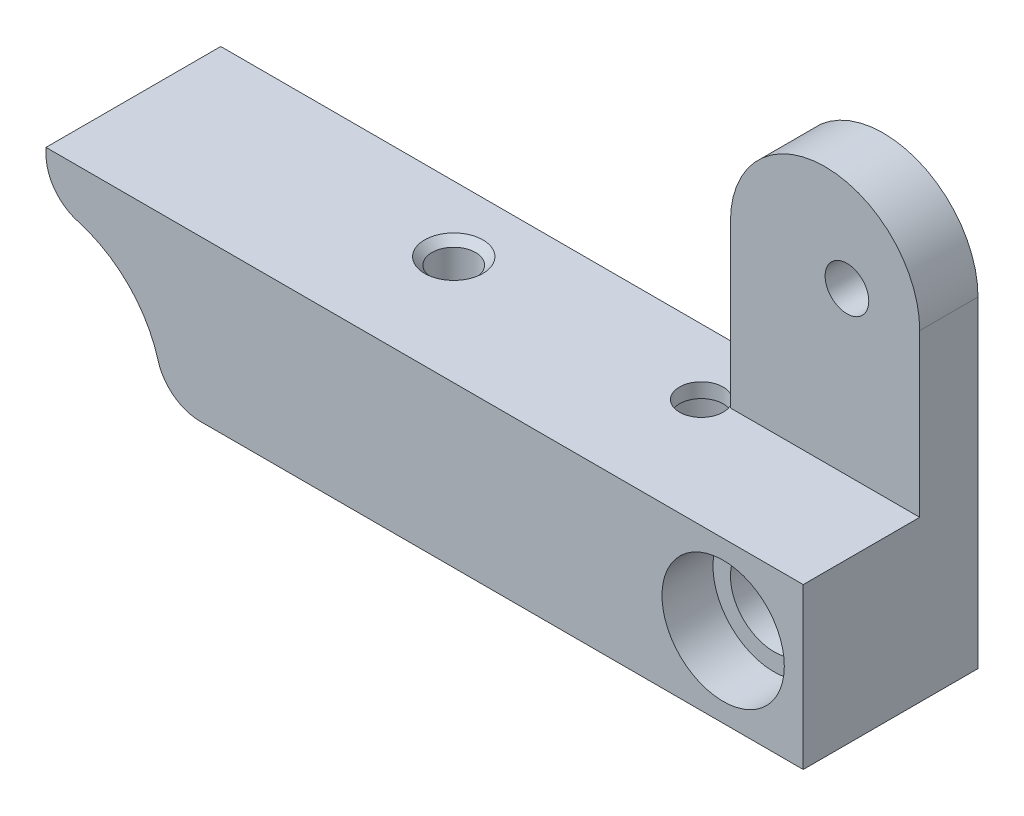
ISO-10303-21;
HEADER;
FILE_DESCRIPTION(('STEP AP214'),'2;1');
FILE_NAME('part.step','',(''),(''),'','','');
FILE_SCHEMA(('AUTOMOTIVE_DESIGN { 1 0 10303 214 1 1 1 1 }'));
ENDSEC;
DATA;
#1=APPLICATION_CONTEXT('core data for automotive mechanical design processes');
#2=APPLICATION_PROTOCOL_DEFINITION('international standard','automotive_design',2000,#1);
#3=PRODUCT_CONTEXT('',#1,'mechanical');
#4=PRODUCT('Part','Part','',(#3));
#5=PRODUCT_RELATED_PRODUCT_CATEGORY('part','',(#4));
#6=PRODUCT_DEFINITION_FORMATION('','',#4);
#7=PRODUCT_DEFINITION_CONTEXT('part definition',#1,'design');
#8=PRODUCT_DEFINITION('design','',#6,#7);
#9=PRODUCT_DEFINITION_SHAPE('','',#8);
#10=(LENGTH_UNIT() NAMED_UNIT(*) SI_UNIT(.MILLI.,.METRE.));
#11=(NAMED_UNIT(*) PLANE_ANGLE_UNIT() SI_UNIT($,.RADIAN.));
#12=(NAMED_UNIT(*) SI_UNIT($,.STERADIAN.) SOLID_ANGLE_UNIT());
#13=UNCERTAINTY_MEASURE_WITH_UNIT(LENGTH_MEASURE(1.E-05),#10,'distance_accuracy_value','');
#14=(GEOMETRIC_REPRESENTATION_CONTEXT(3) GLOBAL_UNCERTAINTY_ASSIGNED_CONTEXT((#13)) GLOBAL_UNIT_ASSIGNED_CONTEXT((#10,
#11,#12)) REPRESENTATION_CONTEXT('',''));
#15=CARTESIAN_POINT('',(0.,0.,0.));
#16=DIRECTION('',(0.,0.,1.));
#17=DIRECTION('',(1.,0.,0.));
#18=AXIS2_PLACEMENT_3D('',#15,#16,#17);
#19=CARTESIAN_POINT('',(10.5830052442584,3.,0.));
#20=DIRECTION('',(0.,0.,1.));
#21=DIRECTION('',(0.,-1.,0.));
#22=AXIS2_PLACEMENT_3D('',#19,#20,#21);
#23=CYLINDRICAL_SURFACE('',#22,3.);
#24=DIRECTION('',(0.,0.,1.));
#25=VECTOR('',#24,1.);
#26=CARTESIAN_POINT('',(10.5830052442584,0.,12.));
#27=LINE('',#26,#25);
#28=CARTESIAN_POINT('',(10.5830052442584,0.,12.));
#29=VERTEX_POINT('',#28);
#30=CARTESIAN_POINT('',(10.5830052442584,0.,0.));
#31=VERTEX_POINT('',#30);
#32=EDGE_CURVE('E250',#29,#31,#27,.F.);
#33=ORIENTED_EDGE('',*,*,#32,.F.);
#34=CARTESIAN_POINT('',(10.5830052442584,3.,12.));
#35=DIRECTION('',(0.,0.,1.));
#36=DIRECTION('',(1.,0.,0.));
#37=AXIS2_PLACEMENT_3D('',#34,#35,#36);
#38=CIRCLE('',#37,3.);
#39=CARTESIAN_POINT('',(7.69673108673336,2.18181818181818,12.));
#40=VERTEX_POINT('',#39);
#41=EDGE_CURVE('E71',#40,#29,#38,.T.);
#42=ORIENTED_EDGE('',*,*,#41,.F.);
#43=DIRECTION('',(0.,0.,1.));
#44=VECTOR('',#43,1.);
#45=CARTESIAN_POINT('',(7.69673108673335,2.18181818181818,0.));
#46=LINE('',#45,#44);
#47=CARTESIAN_POINT('',(7.69673108673335,2.18181818181818,0.));
#48=VERTEX_POINT('',#47);
#49=EDGE_CURVE('E254',#48,#40,#46,.T.);
#50=ORIENTED_EDGE('',*,*,#49,.F.);
#51=CARTESIAN_POINT('',(10.5830052442584,3.,0.));
#52=DIRECTION('',(0.,0.,1.));
#53=DIRECTION('',(1.,0.,0.));
#54=AXIS2_PLACEMENT_3D('',#51,#52,#53);
#55=CIRCLE('',#54,3.);
#56=EDGE_CURVE('E12',#31,#48,#55,.F.);
#57=ORIENTED_EDGE('',*,*,#56,.F.);
#58=EDGE_LOOP('',(#33,#42,#50,#57));
#59=FACE_BOUND('',#58,.T.);
#60=ADVANCED_FACE('F63',(#59),#23,.T.);
#61=CARTESIAN_POINT('',(3.,10.5830052442584,0.));
#62=DIRECTION('',(0.,0.,1.));
#63=DIRECTION('',(0.,-1.,0.));
#64=AXIS2_PLACEMENT_3D('',#61,#62,#63);
#65=CYLINDRICAL_SURFACE('',#64,3.);
#66=DIRECTION('',(0.,0.,1.));
#67=VECTOR('',#66,1.);
#68=CARTESIAN_POINT('',(0.,10.5830052442584,12.));
#69=LINE('',#68,#67);
#70=CARTESIAN_POINT('',(0.,10.5830052442583,0.));
#71=VERTEX_POINT('',#70);
#72=CARTESIAN_POINT('',(0.,10.5830052442583,12.));
#73=VERTEX_POINT('',#72);
#74=EDGE_CURVE('E235',#71,#73,#69,.T.);
#75=ORIENTED_EDGE('',*,*,#74,.F.);
#76=CARTESIAN_POINT('',(3.,10.5830052442584,0.));
#77=DIRECTION('',(0.,0.,1.));
#78=DIRECTION('',(1.,0.,0.));
#79=AXIS2_PLACEMENT_3D('',#76,#77,#78);
#80=CIRCLE('',#79,3.);
#81=CARTESIAN_POINT('',(2.18181818181818,7.69673108673335,0.));
#82=VERTEX_POINT('',#81);
#83=EDGE_CURVE('E243',#82,#71,#80,.F.);
#84=ORIENTED_EDGE('',*,*,#83,.F.);
#85=DIRECTION('',(0.,0.,1.));
#86=VECTOR('',#85,1.);
#87=CARTESIAN_POINT('',(2.18181818181818,7.69673108673335,0.));
#88=LINE('',#87,#86);
#89=CARTESIAN_POINT('',(2.18181818181818,7.69673108673335,12.));
#90=VERTEX_POINT('',#89);
#91=EDGE_CURVE('E239',#90,#82,#88,.F.);
#92=ORIENTED_EDGE('',*,*,#91,.F.);
#93=CARTESIAN_POINT('',(3.,10.5830052442584,12.));
#94=DIRECTION('',(0.,0.,1.));
#95=DIRECTION('',(1.,0.,0.));
#96=AXIS2_PLACEMENT_3D('',#93,#94,#95);
#97=CIRCLE('',#96,3.);
#98=EDGE_CURVE('E246',#73,#90,#97,.T.);
#99=ORIENTED_EDGE('',*,*,#98,.F.);
#100=EDGE_LOOP('',(#75,#84,#92,#99));
#101=FACE_BOUND('',#100,.T.);
#102=ADVANCED_FACE('F279',(#101),#65,.T.);
#103=CARTESIAN_POINT('',(37.5,28.603,4.5));
#104=DIRECTION('',(0.,-1.,0.));
#105=DIRECTION('',(0.,0.,-1.));
#106=AXIS2_PLACEMENT_3D('',#103,#104,#105);
#107=CYLINDRICAL_SURFACE('',#106,1.5);
#108=CARTESIAN_POINT('',(37.5,11.,4.5));
#109=DIRECTION('',(0.,-1.,0.));
#110=DIRECTION('',(1.,0.,0.));
#111=AXIS2_PLACEMENT_3D('',#108,#109,#110);
#112=CIRCLE('',#111,1.5);
#113=CARTESIAN_POINT('',(37.5,11.,3.));
#114=VERTEX_POINT('',#113);
#115=EDGE_CURVE('E218',#114,#114,#112,.T.);
#116=CARTESIAN_POINT('',(37.5,10.,4.5));
#117=DIRECTION('',(0.,-1.,0.));
#118=DIRECTION('',(0.,0.,-1.));
#119=AXIS2_PLACEMENT_3D('',#116,#117,#118);
#120=CIRCLE('',#119,1.5);
#121=CARTESIAN_POINT('',(37.5,10.,3.));
#122=VERTEX_POINT('',#121);
#123=EDGE_CURVE('E214',#122,#122,#120,.F.);
#124=CARTESIAN_POINT('',(37.5,11.,3.));
#125=CARTESIAN_POINT('',(37.5,10.9895833333333,3.));
#126=CARTESIAN_POINT('',(37.5,10.9791666666667,3.));
#127=CARTESIAN_POINT('',(37.5,10.9583333333333,3.));
#128=CARTESIAN_POINT('',(37.5,10.9479166666667,3.));
#129=CARTESIAN_POINT('',(37.5,10.9270833333333,3.));
#130=CARTESIAN_POINT('',(37.5,10.9166666666667,3.));
#131=CARTESIAN_POINT('',(37.5,10.8958333333333,3.));
#132=CARTESIAN_POINT('',(37.5,10.8854166666667,3.));
#133=CARTESIAN_POINT('',(37.5,10.8645833333333,3.));
#134=CARTESIAN_POINT('',(37.5,10.8541666666667,3.));
#135=CARTESIAN_POINT('',(37.5,10.8333333333333,3.));
#136=CARTESIAN_POINT('',(37.5,10.8229166666667,3.));
#137=CARTESIAN_POINT('',(37.5,10.8020833333333,3.));
#138=CARTESIAN_POINT('',(37.5,10.7916666666667,3.));
#139=CARTESIAN_POINT('',(37.5,10.7708333333333,3.));
#140=CARTESIAN_POINT('',(37.5,10.7604166666667,3.));
#141=CARTESIAN_POINT('',(37.5,10.7395833333333,3.));
#142=CARTESIAN_POINT('',(37.5,10.7291666666667,3.));
#143=CARTESIAN_POINT('',(37.5,10.7083333333333,3.));
#144=CARTESIAN_POINT('',(37.5,10.6979166666667,3.));
#145=CARTESIAN_POINT('',(37.5,10.6770833333333,3.));
#146=CARTESIAN_POINT('',(37.5,10.6666666666667,3.));
#147=CARTESIAN_POINT('',(37.5,10.6458333333333,3.));
#148=CARTESIAN_POINT('',(37.5,10.6354166666667,3.));
#149=CARTESIAN_POINT('',(37.5,10.6145833333333,3.));
#150=CARTESIAN_POINT('',(37.5,10.6041666666667,3.));
#151=CARTESIAN_POINT('',(37.5,10.5833333333333,3.));
#152=CARTESIAN_POINT('',(37.5,10.5729166666667,3.));
#153=CARTESIAN_POINT('',(37.5,10.5520833333333,3.));
#154=CARTESIAN_POINT('',(37.5,10.5416666666667,3.));
#155=CARTESIAN_POINT('',(37.5,10.5208333333333,3.));
#156=CARTESIAN_POINT('',(37.5,10.5104166666667,3.));
#157=CARTESIAN_POINT('',(37.5,10.4895833333333,3.));
#158=CARTESIAN_POINT('',(37.5,10.4791666666667,3.));
#159=CARTESIAN_POINT('',(37.5,10.4583333333333,3.));
#160=CARTESIAN_POINT('',(37.5,10.4479166666667,3.));
#161=CARTESIAN_POINT('',(37.5,10.4270833333333,3.));
#162=CARTESIAN_POINT('',(37.5,10.4166666666667,3.));
#163=CARTESIAN_POINT('',(37.5,10.3958333333333,3.));
#164=CARTESIAN_POINT('',(37.5,10.3854166666667,3.));
#165=CARTESIAN_POINT('',(37.5,10.3645833333333,3.));
#166=CARTESIAN_POINT('',(37.5,10.3541666666667,3.));
#167=CARTESIAN_POINT('',(37.5,10.3333333333333,3.));
#168=CARTESIAN_POINT('',(37.5,10.3229166666667,3.));
#169=CARTESIAN_POINT('',(37.5,10.3020833333333,3.));
#170=CARTESIAN_POINT('',(37.5,10.2916666666667,3.));
#171=CARTESIAN_POINT('',(37.5,10.2708333333333,3.));
#172=CARTESIAN_POINT('',(37.5,10.2604166666667,3.));
#173=CARTESIAN_POINT('',(37.5,10.2395833333333,3.));
#174=CARTESIAN_POINT('',(37.5,10.2291666666667,3.));
#175=CARTESIAN_POINT('',(37.5,10.2083333333333,3.));
#176=CARTESIAN_POINT('',(37.5,10.1979166666667,3.));
#177=CARTESIAN_POINT('',(37.5,10.1770833333333,3.));
#178=CARTESIAN_POINT('',(37.5,10.1666666666667,3.));
#179=CARTESIAN_POINT('',(37.5,10.1458333333333,3.));
#180=CARTESIAN_POINT('',(37.5,10.1354166666667,3.));
#181=CARTESIAN_POINT('',(37.5,10.1145833333333,3.));
#182=CARTESIAN_POINT('',(37.5,10.1041666666667,3.));
#183=CARTESIAN_POINT('',(37.5,10.0833333333333,3.));
#184=CARTESIAN_POINT('',(37.5,10.0729166666667,3.));
#185=CARTESIAN_POINT('',(37.5,10.0520833333333,3.));
#186=CARTESIAN_POINT('',(37.5,10.0416666666667,3.));
#187=CARTESIAN_POINT('',(37.5,10.0208333333333,3.));
#188=CARTESIAN_POINT('',(37.5,10.0104166666667,3.));
#189=CARTESIAN_POINT('',(37.5,10.,3.));
#190=B_SPLINE_CURVE_WITH_KNOTS('',3,(#124,#125,#126,#127,#128,#129,#130,#131,#132,#133,#134,
#135,#136,#137,#138,#139,#140,#141,#142,#143,#144,#145,#146,#147,#148,#149,#150,#151,#152,#153,
#154,#155,#156,#157,#158,#159,#160,#161,#162,#163,#164,#165,#166,#167,#168,#169,#170,#171,#172,
#173,#174,#175,#176,#177,#178,#179,#180,#181,#182,#183,#184,#185,#186,#187,#188,#189),
.UNSPECIFIED.,.F.,.F.,(4,2,2,2,2,2,2,2,2,2,2,2,2,2,2,2,2,2,2,2,2,2,2,2,2,2,2,2,2,2,2,2,4),(0.,
0.03125,0.0625000000000001,0.0937500000000001,0.125,0.15625,0.1875,0.21875,0.25,0.28125,0.3125,
0.34375,0.375,0.40625,0.4375,0.46875,0.5,0.53125,0.5625,0.593750000000001,0.625000000000001,
0.656250000000001,0.687500000000001,0.718750000000001,0.750000000000001,0.781250000000001,
0.812500000000001,0.843750000000001,0.875000000000001,0.906250000000001,0.937500000000001,
0.968750000000001,1.),.UNSPECIFIED.);
#191=EDGE_CURVE('BSEAM299',#114,#122,#190,.T.);
#192=ORIENTED_EDGE('',*,*,#115,.F.);
#193=ORIENTED_EDGE('',*,*,#123,.F.);
#194=ORIENTED_EDGE('',*,*,#191,.T.);
#195=ORIENTED_EDGE('',*,*,#191,.F.);
#196=EDGE_LOOP('',(#192,#194,#193,#195));
#197=FACE_BOUND('',#196,.T.);
#198=ADVANCED_FACE('F299',(#197),#107,.F.);
#199=CARTESIAN_POINT('',(0.,0.,0.));
#200=DIRECTION('',(0.,0.,1.));
#201=DIRECTION('',(1.,0.,0.));
#202=AXIS2_PLACEMENT_3D('',#199,#200,#201);
#203=PLANE('',#202);
#204=CARTESIAN_POINT('',(46.5,5.49999999999997,0.));
#205=DIRECTION('',(0.,0.,1.));
#206=DIRECTION('',(1.,0.,0.));
#207=AXIS2_PLACEMENT_3D('',#204,#205,#206);
#208=CIRCLE('',#207,1.6);
#209=CARTESIAN_POINT('',(48.1,5.49999999999997,0.));
#210=VERTEX_POINT('',#209);
#211=EDGE_CURVE('E342',#210,#210,#208,.T.);
#212=ORIENTED_EDGE('',*,*,#211,.T.);
#213=EDGE_LOOP('',(#212));
#214=FACE_BOUND('',#213,.T.);
#215=CARTESIAN_POINT('',(47.,22.103,0.));
#216=DIRECTION('',(0.,0.,1.));
#217=DIRECTION('',(1.,0.,0.));
#218=AXIS2_PLACEMENT_3D('',#215,#216,#217);
#219=CIRCLE('',#218,1.5);
#220=CARTESIAN_POINT('',(48.5,22.103,0.));
#221=VERTEX_POINT('',#220);
#222=EDGE_CURVE('E157',#221,#221,#219,.T.);
#223=ORIENTED_EDGE('',*,*,#222,.T.);
#224=EDGE_LOOP('',(#223));
#225=FACE_BOUND('',#224,.T.);
#226=DIRECTION('',(1.,0.,0.));
#227=VECTOR('',#226,1.);
#228=CARTESIAN_POINT('',(0.,0.,0.));
#229=LINE('',#228,#227);
#230=CARTESIAN_POINT('',(52.,0.,0.));
#231=VERTEX_POINT('',#230);
#232=EDGE_CURVE('E194',#31,#231,#229,.T.);
#233=ORIENTED_EDGE('',*,*,#232,.F.);
#234=ORIENTED_EDGE('',*,*,#56,.T.);
#235=CARTESIAN_POINT('',(0.,0.,0.));
#236=DIRECTION('',(0.,0.,1.));
#237=DIRECTION('',(0.,-1.,0.));
#238=AXIS2_PLACEMENT_3D('',#235,#236,#237);
#239=CIRCLE('',#238,8.);
#240=EDGE_CURVE('E164',#48,#82,#239,.T.);
#241=ORIENTED_EDGE('',*,*,#240,.T.);
#242=ORIENTED_EDGE('',*,*,#83,.T.);
#243=DIRECTION('',(0.,-1.,0.));
#244=VECTOR('',#243,1.);
#245=CARTESIAN_POINT('',(0.,11.,0.));
#246=LINE('',#245,#244);
#247=CARTESIAN_POINT('',(0.,11.,0.));
#248=VERTEX_POINT('',#247);
#249=EDGE_CURVE('E176',#248,#71,#246,.T.);
#250=ORIENTED_EDGE('',*,*,#249,.F.);
#251=DIRECTION('',(-1.,0.,0.));
#252=VECTOR('',#251,1.);
#253=CARTESIAN_POINT('',(52.,11.,0.));
#254=LINE('',#253,#252);
#255=CARTESIAN_POINT('',(39.,11.,0.));
#256=VERTEX_POINT('',#255);
#257=EDGE_CURVE('E162',#256,#248,#254,.T.);
#258=ORIENTED_EDGE('',*,*,#257,.F.);
#259=DIRECTION('',(0.,-1.,0.));
#260=VECTOR('',#259,1.);
#261=CARTESIAN_POINT('',(39.,28.603,0.));
#262=LINE('',#261,#260);
#263=CARTESIAN_POINT('',(39.,22.103,0.));
#264=VERTEX_POINT('',#263);
#265=EDGE_CURVE('E153',#264,#256,#262,.T.);
#266=ORIENTED_EDGE('',*,*,#265,.F.);
#267=CARTESIAN_POINT('',(45.5,22.103,0.));
#268=DIRECTION('',(0.,0.,1.));
#269=DIRECTION('',(1.,0.,0.));
#270=AXIS2_PLACEMENT_3D('',#267,#268,#269);
#271=CIRCLE('',#270,6.5);
#272=CARTESIAN_POINT('',(52.,22.103,0.));
#273=VERTEX_POINT('',#272);
#274=EDGE_CURVE('E137',#273,#264,#271,.T.);
#275=ORIENTED_EDGE('',*,*,#274,.F.);
#276=DIRECTION('',(0.,1.,0.));
#277=VECTOR('',#276,1.);
#278=CARTESIAN_POINT('',(52.,0.,0.));
#279=LINE('',#278,#277);
#280=EDGE_CURVE('E197',#231,#273,#279,.T.);
#281=ORIENTED_EDGE('',*,*,#280,.F.);
#282=EDGE_LOOP('',(#233,#234,#241,#242,#250,#258,#266,#275,#281));
#283=FACE_BOUND('',#282,.T.);
#284=ADVANCED_FACE('F160',(#214,#225,#283),#203,.F.);
#285=CARTESIAN_POINT('',(52.,28.603,4.));
#286=DIRECTION('',(0.,0.,-1.));
#287=DIRECTION('',(-1.,0.,0.));
#288=AXIS2_PLACEMENT_3D('',#285,#286,#287);
#289=PLANE('',#288);
#290=CARTESIAN_POINT('',(47.,22.103,4.00000000000001));
#291=DIRECTION('',(0.,0.,1.));
#292=DIRECTION('',(1.,0.,0.));
#293=AXIS2_PLACEMENT_3D('',#290,#291,#292);
#294=CIRCLE('',#293,1.5);
#295=CARTESIAN_POINT('',(48.5,22.103,4.00000000000001));
#296=VERTEX_POINT('',#295);
#297=EDGE_CURVE('E347',#296,#296,#294,.T.);
#298=ORIENTED_EDGE('',*,*,#297,.F.);
#299=EDGE_LOOP('',(#298));
#300=FACE_BOUND('',#299,.T.);
#301=CARTESIAN_POINT('',(45.5,22.103,4.00000000000001));
#302=DIRECTION('',(0.,0.,1.));
#303=DIRECTION('',(1.,0.,0.));
#304=AXIS2_PLACEMENT_3D('',#301,#302,#303);
#305=CIRCLE('',#304,6.5);
#306=CARTESIAN_POINT('',(52.,22.103,4.00000000000001));
#307=VERTEX_POINT('',#306);
#308=CARTESIAN_POINT('',(39.,22.103,4.00000000000001));
#309=VERTEX_POINT('',#308);
#310=EDGE_CURVE('E148',#307,#309,#305,.T.);
#311=ORIENTED_EDGE('',*,*,#310,.T.);
#312=DIRECTION('',(0.,-1.,0.));
#313=VECTOR('',#312,1.);
#314=CARTESIAN_POINT('',(39.,28.603,4.));
#315=LINE('',#314,#313);
#316=CARTESIAN_POINT('',(39.,11.,4.));
#317=VERTEX_POINT('',#316);
#318=EDGE_CURVE('E155',#309,#317,#315,.T.);
#319=ORIENTED_EDGE('',*,*,#318,.T.);
#320=DIRECTION('',(1.,0.,0.));
#321=VECTOR('',#320,1.);
#322=CARTESIAN_POINT('',(52.,11.,4.));
#323=LINE('',#322,#321);
#324=CARTESIAN_POINT('',(52.,11.,4.));
#325=VERTEX_POINT('',#324);
#326=EDGE_CURVE('E364',#317,#325,#323,.T.);
#327=ORIENTED_EDGE('',*,*,#326,.T.);
#328=DIRECTION('',(0.,-1.,0.));
#329=VECTOR('',#328,1.);
#330=CARTESIAN_POINT('',(52.,28.603,4.));
#331=LINE('',#330,#329);
#332=EDGE_CURVE('E170',#307,#325,#331,.T.);
#333=ORIENTED_EDGE('',*,*,#332,.F.);
#334=EDGE_LOOP('',(#311,#319,#327,#333));
#335=FACE_BOUND('',#334,.T.);
#336=ADVANCED_FACE('F332',(#300,#335),#289,.F.);
#337=CARTESIAN_POINT('',(39.,28.603,0.));
#338=DIRECTION('',(1.,0.,0.));
#339=DIRECTION('',(0.,1.,0.));
#340=AXIS2_PLACEMENT_3D('',#337,#338,#339);
#341=PLANE('',#340);
#342=DIRECTION('',(0.,0.,1.));
#343=VECTOR('',#342,1.);
#344=CARTESIAN_POINT('',(39.,22.103,0.));
#345=LINE('',#344,#343);
#346=EDGE_CURVE('E140',#264,#309,#345,.T.);
#347=ORIENTED_EDGE('',*,*,#346,.F.);
#348=ORIENTED_EDGE('',*,*,#265,.T.);
#349=DIRECTION('',(0.,0.,1.));
#350=VECTOR('',#349,1.);
#351=CARTESIAN_POINT('',(39.,11.,0.));
#352=LINE('',#351,#350);
#353=EDGE_CURVE('E361',#256,#317,#352,.T.);
#354=ORIENTED_EDGE('',*,*,#353,.T.);
#355=ORIENTED_EDGE('',*,*,#318,.F.);
#356=EDGE_LOOP('',(#347,#348,#354,#355));
#357=FACE_BOUND('',#356,.T.);
#358=ADVANCED_FACE('F151',(#357),#341,.F.);
#359=CARTESIAN_POINT('',(52.,11.,12.));
#360=DIRECTION('',(0.,-1.,0.));
#361=DIRECTION('',(1.,0.,0.));
#362=AXIS2_PLACEMENT_3D('',#359,#360,#361);
#363=PLANE('',#362);
#364=CARTESIAN_POINT('',(20.5,11.,4.5));
#365=DIRECTION('',(0.,-1.,0.));
#366=DIRECTION('',(1.,0.,0.));
#367=AXIS2_PLACEMENT_3D('',#364,#365,#366);
#368=CIRCLE('',#367,2.00000000000003);
#369=CARTESIAN_POINT('',(22.5,11.,4.5));
#370=VERTEX_POINT('',#369);
#371=EDGE_CURVE('E213',#370,#370,#368,.T.);
#372=ORIENTED_EDGE('',*,*,#371,.T.);
#373=EDGE_LOOP('',(#372));
#374=FACE_BOUND('',#373,.T.);
#375=ORIENTED_EDGE('',*,*,#115,.T.);
#376=EDGE_LOOP('',(#375));
#377=FACE_BOUND('',#376,.T.);
#378=ORIENTED_EDGE('',*,*,#326,.F.);
#379=ORIENTED_EDGE('',*,*,#353,.F.);
#380=ORIENTED_EDGE('',*,*,#257,.T.);
#381=DIRECTION('',(0.,0.,-1.));
#382=VECTOR('',#381,1.);
#383=CARTESIAN_POINT('',(0.,11.,12.));
#384=LINE('',#383,#382);
#385=CARTESIAN_POINT('',(0.,11.,12.));
#386=VERTEX_POINT('',#385);
#387=EDGE_CURVE('E190',#386,#248,#384,.T.);
#388=ORIENTED_EDGE('',*,*,#387,.F.);
#389=DIRECTION('',(-1.,0.,0.));
#390=VECTOR('',#389,1.);
#391=CARTESIAN_POINT('',(52.,11.,12.));
#392=LINE('',#391,#390);
#393=CARTESIAN_POINT('',(52.,11.,12.));
#394=VERTEX_POINT('',#393);
#395=EDGE_CURVE('E187',#394,#386,#392,.T.);
#396=ORIENTED_EDGE('',*,*,#395,.F.);
#397=DIRECTION('',(0.,0.,-1.));
#398=VECTOR('',#397,1.);
#399=CARTESIAN_POINT('',(52.,11.,12.));
#400=LINE('',#399,#398);
#401=EDGE_CURVE('E205',#394,#325,#400,.T.);
#402=ORIENTED_EDGE('',*,*,#401,.T.);
#403=EDGE_LOOP('',(#378,#379,#380,#388,#396,#402));
#404=FACE_BOUND('',#403,.T.);
#405=ADVANCED_FACE('F273',(#374,#377,#404),#363,.F.);
#406=CARTESIAN_POINT('',(0.,11.,12.));
#407=DIRECTION('',(1.,0.,0.));
#408=DIRECTION('',(0.,1.,0.));
#409=AXIS2_PLACEMENT_3D('',#406,#407,#408);
#410=PLANE('',#409);
#411=ORIENTED_EDGE('',*,*,#249,.T.);
#412=ORIENTED_EDGE('',*,*,#74,.T.);
#413=DIRECTION('',(0.,-1.,0.));
#414=VECTOR('',#413,1.);
#415=CARTESIAN_POINT('',(0.,11.,12.));
#416=LINE('',#415,#414);
#417=EDGE_CURVE('E177',#386,#73,#416,.T.);
#418=ORIENTED_EDGE('',*,*,#417,.F.);
#419=ORIENTED_EDGE('',*,*,#387,.T.);
#420=EDGE_LOOP('',(#411,#412,#418,#419));
#421=FACE_BOUND('',#420,.T.);
#422=ADVANCED_FACE('F275',(#421),#410,.F.);
#423=CARTESIAN_POINT('',(0.,0.,12.));
#424=DIRECTION('',(0.,1.,0.));
#425=DIRECTION('',(0.,0.,1.));
#426=AXIS2_PLACEMENT_3D('',#423,#424,#425);
#427=PLANE('',#426);
#428=CARTESIAN_POINT('',(20.5,0.,4.5));
#429=DIRECTION('',(0.,1.,0.));
#430=DIRECTION('',(0.,0.,1.));
#431=AXIS2_PLACEMENT_3D('',#428,#429,#430);
#432=CIRCLE('',#431,1.99999999999999);
#433=CARTESIAN_POINT('',(20.5,0.,6.49999999999999));
#434=VERTEX_POINT('',#433);
#435=EDGE_CURVE('E231',#434,#434,#432,.T.);
#436=ORIENTED_EDGE('',*,*,#435,.T.);
#437=EDGE_LOOP('',(#436));
#438=FACE_BOUND('',#437,.T.);
#439=CARTESIAN_POINT('',(37.5,0.,4.5));
#440=DIRECTION('',(0.,-1.,0.));
#441=DIRECTION('',(0.,0.,-1.));
#442=AXIS2_PLACEMENT_3D('',#439,#440,#441);
#443=CIRCLE('',#442,3.);
#444=CARTESIAN_POINT('',(37.5,0.,1.5));
#445=VERTEX_POINT('',#444);
#446=EDGE_CURVE('E392',#445,#445,#443,.T.);
#447=ORIENTED_EDGE('',*,*,#446,.F.);
#448=EDGE_LOOP('',(#447));
#449=FACE_BOUND('',#448,.T.);
#450=DIRECTION('',(1.,0.,0.));
#451=VECTOR('',#450,1.);
#452=CARTESIAN_POINT('',(0.,0.,12.));
#453=LINE('',#452,#451);
#454=CARTESIAN_POINT('',(52.,0.,12.));
#455=VERTEX_POINT('',#454);
#456=EDGE_CURVE('E181',#29,#455,#453,.T.);
#457=ORIENTED_EDGE('',*,*,#456,.F.);
#458=ORIENTED_EDGE('',*,*,#32,.T.);
#459=ORIENTED_EDGE('',*,*,#232,.T.);
#460=DIRECTION('',(0.,0.,-1.));
#461=VECTOR('',#460,1.);
#462=CARTESIAN_POINT('',(52.,0.,12.));
#463=LINE('',#462,#461);
#464=EDGE_CURVE('E209',#455,#231,#463,.T.);
#465=ORIENTED_EDGE('',*,*,#464,.F.);
#466=EDGE_LOOP('',(#457,#458,#459,#465));
#467=FACE_BOUND('',#466,.T.);
#468=ADVANCED_FACE('F263',(#438,#449,#467),#427,.F.);
#469=CARTESIAN_POINT('',(52.,0.,12.));
#470=DIRECTION('',(-1.,0.,0.));
#471=DIRECTION('',(0.,0.,1.));
#472=AXIS2_PLACEMENT_3D('',#469,#470,#471);
#473=PLANE('',#472);
#474=ORIENTED_EDGE('',*,*,#280,.T.);
#475=DIRECTION('',(0.,0.,1.));
#476=VECTOR('',#475,1.);
#477=CARTESIAN_POINT('',(52.,22.103,0.));
#478=LINE('',#477,#476);
#479=EDGE_CURVE('E143',#273,#307,#478,.T.);
#480=ORIENTED_EDGE('',*,*,#479,.T.);
#481=ORIENTED_EDGE('',*,*,#332,.T.);
#482=ORIENTED_EDGE('',*,*,#401,.F.);
#483=DIRECTION('',(0.,1.,0.));
#484=VECTOR('',#483,1.);
#485=CARTESIAN_POINT('',(52.,0.,12.));
#486=LINE('',#485,#484);
#487=EDGE_CURVE('E184',#455,#394,#486,.T.);
#488=ORIENTED_EDGE('',*,*,#487,.F.);
#489=ORIENTED_EDGE('',*,*,#464,.T.);
#490=EDGE_LOOP('',(#474,#480,#481,#482,#488,#489));
#491=FACE_BOUND('',#490,.T.);
#492=ADVANCED_FACE('F267',(#491),#473,.F.);
#493=CARTESIAN_POINT('',(0.,0.,12.));
#494=DIRECTION('',(0.,0.,1.));
#495=DIRECTION('',(1.,0.,0.));
#496=AXIS2_PLACEMENT_3D('',#493,#494,#495);
#497=PLANE('',#496);
#498=CARTESIAN_POINT('',(46.5,5.49999999999997,12.));
#499=DIRECTION('',(0.,0.,1.));
#500=DIRECTION('',(1.,0.,0.));
#501=AXIS2_PLACEMENT_3D('',#498,#499,#500);
#502=CIRCLE('',#501,4.2);
#503=CARTESIAN_POINT('',(50.7,5.49999999999997,12.));
#504=VERTEX_POINT('',#503);
#505=EDGE_CURVE('E354',#504,#504,#502,.T.);
#506=ORIENTED_EDGE('',*,*,#505,.F.);
#507=EDGE_LOOP('',(#506));
#508=FACE_BOUND('',#507,.T.);
#509=CARTESIAN_POINT('',(0.,0.,12.));
#510=DIRECTION('',(0.,0.,1.));
#511=DIRECTION('',(0.,-1.,0.));
#512=AXIS2_PLACEMENT_3D('',#509,#510,#511);
#513=CIRCLE('',#512,8.);
#514=EDGE_CURVE('E168',#40,#90,#513,.T.);
#515=ORIENTED_EDGE('',*,*,#514,.F.);
#516=ORIENTED_EDGE('',*,*,#41,.T.);
#517=ORIENTED_EDGE('',*,*,#456,.T.);
#518=ORIENTED_EDGE('',*,*,#487,.T.);
#519=ORIENTED_EDGE('',*,*,#395,.T.);
#520=ORIENTED_EDGE('',*,*,#417,.T.);
#521=ORIENTED_EDGE('',*,*,#98,.T.);
#522=EDGE_LOOP('',(#515,#516,#517,#518,#519,#520,#521));
#523=FACE_BOUND('',#522,.T.);
#524=ADVANCED_FACE('F259',(#508,#523),#497,.T.);
#525=CARTESIAN_POINT('',(0.,0.,0.));
#526=DIRECTION('',(0.,0.,1.));
#527=DIRECTION('',(0.,-1.,0.));
#528=AXIS2_PLACEMENT_3D('',#525,#526,#527);
#529=CYLINDRICAL_SURFACE('',#528,8.);
#530=ORIENTED_EDGE('',*,*,#240,.F.);
#531=ORIENTED_EDGE('',*,*,#49,.T.);
#532=ORIENTED_EDGE('',*,*,#514,.T.);
#533=ORIENTED_EDGE('',*,*,#91,.T.);
#534=EDGE_LOOP('',(#530,#531,#532,#533));
#535=FACE_BOUND('',#534,.T.);
#536=ADVANCED_FACE('F283',(#535),#529,.F.);
#537=CARTESIAN_POINT('',(45.5,22.103,0.));
#538=DIRECTION('',(0.,0.,1.));
#539=DIRECTION('',(1.,0.,0.));
#540=AXIS2_PLACEMENT_3D('',#537,#538,#539);
#541=CYLINDRICAL_SURFACE('',#540,6.5);
#542=ORIENTED_EDGE('',*,*,#310,.F.);
#543=ORIENTED_EDGE('',*,*,#479,.F.);
#544=ORIENTED_EDGE('',*,*,#274,.T.);
#545=ORIENTED_EDGE('',*,*,#346,.T.);
#546=EDGE_LOOP('',(#542,#543,#544,#545));
#547=FACE_BOUND('',#546,.T.);
#548=ADVANCED_FACE('F139',(#547),#541,.T.);
#549=CARTESIAN_POINT('',(47.,22.103,0.));
#550=DIRECTION('',(0.,0.,1.));
#551=DIRECTION('',(1.,0.,0.));
#552=AXIS2_PLACEMENT_3D('',#549,#550,#551);
#553=CYLINDRICAL_SURFACE('',#552,1.5);
#554=ORIENTED_EDGE('',*,*,#222,.F.);
#555=EDGE_LOOP('',(#554));
#556=FACE_BOUND('',#555,.T.);
#557=ORIENTED_EDGE('',*,*,#297,.T.);
#558=EDGE_LOOP('',(#557));
#559=FACE_BOUND('',#558,.T.);
#560=ADVANCED_FACE('F290',(#556,#559),#553,.F.);
#561=CARTESIAN_POINT('',(46.5,5.49999999999997,8.5));
#562=DIRECTION('',(0.,0.,1.));
#563=DIRECTION('',(1.,0.,0.));
#564=AXIS2_PLACEMENT_3D('',#561,#562,#563);
#565=CYLINDRICAL_SURFACE('',#564,4.2);
#566=CARTESIAN_POINT('',(46.5,5.49999999999997,8.5));
#567=DIRECTION('',(0.,0.,1.));
#568=DIRECTION('',(1.,0.,0.));
#569=AXIS2_PLACEMENT_3D('',#566,#567,#568);
#570=CIRCLE('',#569,4.2);
#571=CARTESIAN_POINT('',(50.7,5.49999999999997,8.5));
#572=VERTEX_POINT('',#571);
#573=EDGE_CURVE('E351',#572,#572,#570,.T.);
#574=ORIENTED_EDGE('',*,*,#573,.F.);
#575=EDGE_LOOP('',(#574));
#576=FACE_BOUND('',#575,.T.);
#577=ORIENTED_EDGE('',*,*,#505,.T.);
#578=EDGE_LOOP('',(#577));
#579=FACE_BOUND('',#578,.T.);
#580=ADVANCED_FACE('F432',(#576,#579),#565,.F.);
#581=CARTESIAN_POINT('',(46.5,5.49999999999997,8.5));
#582=DIRECTION('',(0.,0.,1.));
#583=DIRECTION('',(1.,0.,0.));
#584=AXIS2_PLACEMENT_3D('',#581,#582,#583);
#585=PLANE('',#584);
#586=CARTESIAN_POINT('',(46.5,5.49999999999997,8.5));
#587=DIRECTION('',(0.,0.,1.));
#588=DIRECTION('',(1.,0.,0.));
#589=AXIS2_PLACEMENT_3D('',#586,#587,#588);
#590=CIRCLE('',#589,3.);
#591=CARTESIAN_POINT('',(49.5,5.49999999999997,8.5));
#592=VERTEX_POINT('',#591);
#593=EDGE_CURVE('E376',#592,#592,#590,.T.);
#594=ORIENTED_EDGE('',*,*,#593,.F.);
#595=EDGE_LOOP('',(#594));
#596=FACE_BOUND('',#595,.T.);
#597=ORIENTED_EDGE('',*,*,#573,.T.);
#598=EDGE_LOOP('',(#597));
#599=FACE_BOUND('',#598,.T.);
#600=ADVANCED_FACE('F428',(#596,#599),#585,.T.);
#601=CARTESIAN_POINT('',(46.5,5.49999999999997,1.));
#602=DIRECTION('',(0.,0.,1.));
#603=DIRECTION('',(1.,0.,0.));
#604=AXIS2_PLACEMENT_3D('',#601,#602,#603);
#605=CYLINDRICAL_SURFACE('',#604,3.);
#606=CARTESIAN_POINT('',(46.5,5.49999999999997,1.));
#607=DIRECTION('',(0.,0.,1.));
#608=DIRECTION('',(1.,0.,0.));
#609=AXIS2_PLACEMENT_3D('',#606,#607,#608);
#610=CIRCLE('',#609,3.);
#611=CARTESIAN_POINT('',(49.5,5.49999999999997,1.));
#612=VERTEX_POINT('',#611);
#613=EDGE_CURVE('E372',#612,#612,#610,.T.);
#614=ORIENTED_EDGE('',*,*,#613,.F.);
#615=EDGE_LOOP('',(#614));
#616=FACE_BOUND('',#615,.T.);
#617=ORIENTED_EDGE('',*,*,#593,.T.);
#618=EDGE_LOOP('',(#617));
#619=FACE_BOUND('',#618,.T.);
#620=ADVANCED_FACE('F424',(#616,#619),#605,.F.);
#621=CARTESIAN_POINT('',(46.5,5.49999999999997,1.));
#622=DIRECTION('',(0.,0.,1.));
#623=DIRECTION('',(1.,0.,0.));
#624=AXIS2_PLACEMENT_3D('',#621,#622,#623);
#625=PLANE('',#624);
#626=CARTESIAN_POINT('',(46.5,5.49999999999997,1.));
#627=DIRECTION('',(0.,0.,1.));
#628=DIRECTION('',(1.,0.,0.));
#629=AXIS2_PLACEMENT_3D('',#626,#627,#628);
#630=CIRCLE('',#629,1.6);
#631=CARTESIAN_POINT('',(48.1,5.49999999999997,1.));
#632=VERTEX_POINT('',#631);
#633=EDGE_CURVE('E383',#632,#632,#630,.T.);
#634=ORIENTED_EDGE('',*,*,#633,.F.);
#635=EDGE_LOOP('',(#634));
#636=FACE_BOUND('',#635,.T.);
#637=ORIENTED_EDGE('',*,*,#613,.T.);
#638=EDGE_LOOP('',(#637));
#639=FACE_BOUND('',#638,.T.);
#640=ADVANCED_FACE('F420',(#636,#639),#625,.T.);
#641=CARTESIAN_POINT('',(46.5,5.49999999999997,0.));
#642=DIRECTION('',(0.,0.,1.));
#643=DIRECTION('',(1.,0.,0.));
#644=AXIS2_PLACEMENT_3D('',#641,#642,#643);
#645=CYLINDRICAL_SURFACE('',#644,1.6);
#646=ORIENTED_EDGE('',*,*,#211,.F.);
#647=EDGE_LOOP('',(#646));
#648=FACE_BOUND('',#647,.T.);
#649=ORIENTED_EDGE('',*,*,#633,.T.);
#650=EDGE_LOOP('',(#649));
#651=FACE_BOUND('',#650,.T.);
#652=ADVANCED_FACE('F416',(#648,#651),#645,.F.);
#653=CARTESIAN_POINT('',(20.5,28.603,4.5));
#654=DIRECTION('',(0.,-1.,0.));
#655=DIRECTION('',(0.,0.,-1.));
#656=AXIS2_PLACEMENT_3D('',#653,#654,#655);
#657=CYLINDRICAL_SURFACE('',#656,1.5);
#658=CARTESIAN_POINT('',(20.5,10.5,4.5));
#659=DIRECTION('',(0.,-1.,0.));
#660=DIRECTION('',(0.,0.,-1.));
#661=AXIS2_PLACEMENT_3D('',#658,#659,#660);
#662=CIRCLE('',#661,1.5);
#663=CARTESIAN_POINT('',(20.5,10.5,3.));
#664=VERTEX_POINT('',#663);
#665=EDGE_CURVE('E227',#664,#664,#662,.F.);
#666=CARTESIAN_POINT('',(20.5,0.5,4.5));
#667=DIRECTION('',(0.,1.,0.));
#668=DIRECTION('',(0.,0.,1.));
#669=AXIS2_PLACEMENT_3D('',#666,#667,#668);
#670=CIRCLE('',#669,1.5);
#671=CARTESIAN_POINT('',(20.5,0.499999999999997,3.));
#672=VERTEX_POINT('',#671);
#673=EDGE_CURVE('E223',#672,#672,#670,.F.);
#674=CARTESIAN_POINT('',(20.5,10.5,3.));
#675=CARTESIAN_POINT('',(20.5,10.3958333333333,3.));
#676=CARTESIAN_POINT('',(20.5,10.2916666666666,3.));
#677=CARTESIAN_POINT('',(20.5,10.0833333333333,3.));
#678=CARTESIAN_POINT('',(20.5,9.97916666666664,3.));
#679=CARTESIAN_POINT('',(20.5,9.77083333333331,3.));
#680=CARTESIAN_POINT('',(20.5,9.66666666666664,3.));
#681=CARTESIAN_POINT('',(20.5,9.45833333333331,3.));
#682=CARTESIAN_POINT('',(20.5,9.35416666666664,3.));
#683=CARTESIAN_POINT('',(20.5,9.14583333333331,3.));
#684=CARTESIAN_POINT('',(20.5,9.04166666666664,3.));
#685=CARTESIAN_POINT('',(20.5,8.83333333333331,3.));
#686=CARTESIAN_POINT('',(20.5,8.72916666666664,3.));
#687=CARTESIAN_POINT('',(20.5,8.52083333333331,3.));
#688=CARTESIAN_POINT('',(20.5,8.41666666666664,3.));
#689=CARTESIAN_POINT('',(20.5,8.20833333333331,3.));
#690=CARTESIAN_POINT('',(20.5,8.10416666666664,3.));
#691=CARTESIAN_POINT('',(20.5,7.89583333333331,3.));
#692=CARTESIAN_POINT('',(20.5,7.79166666666664,3.));
#693=CARTESIAN_POINT('',(20.5,7.58333333333331,3.));
#694=CARTESIAN_POINT('',(20.5,7.47916666666665,3.));
#695=CARTESIAN_POINT('',(20.5,7.27083333333331,3.));
#696=CARTESIAN_POINT('',(20.5,7.16666666666665,3.));
#697=CARTESIAN_POINT('',(20.5,6.95833333333332,3.));
#698=CARTESIAN_POINT('',(20.5,6.85416666666665,3.));
#699=CARTESIAN_POINT('',(20.5,6.64583333333332,3.));
#700=CARTESIAN_POINT('',(20.5,6.54166666666665,3.));
#701=CARTESIAN_POINT('',(20.5,6.33333333333332,3.));
#702=CARTESIAN_POINT('',(20.5,6.22916666666665,3.));
#703=CARTESIAN_POINT('',(20.5,6.02083333333332,3.));
#704=CARTESIAN_POINT('',(20.5,5.91666666666665,3.));
#705=CARTESIAN_POINT('',(20.5,5.70833333333332,3.));
#706=CARTESIAN_POINT('',(20.5,5.60416666666665,3.));
#707=CARTESIAN_POINT('',(20.5,5.39583333333332,3.));
#708=CARTESIAN_POINT('',(20.5,5.29166666666665,3.));
#709=CARTESIAN_POINT('',(20.5,5.08333333333332,3.));
#710=CARTESIAN_POINT('',(20.5,4.97916666666665,3.));
#711=CARTESIAN_POINT('',(20.5,4.77083333333332,3.));
#712=CARTESIAN_POINT('',(20.5,4.66666666666665,3.));
#713=CARTESIAN_POINT('',(20.5,4.45833333333332,3.));
#714=CARTESIAN_POINT('',(20.5,4.35416666666665,3.));
#715=CARTESIAN_POINT('',(20.5,4.14583333333332,3.));
#716=CARTESIAN_POINT('',(20.5,4.04166666666665,3.));
#717=CARTESIAN_POINT('',(20.5,3.83333333333332,3.));
#718=CARTESIAN_POINT('',(20.5,3.72916666666665,3.));
#719=CARTESIAN_POINT('',(20.5,3.52083333333332,3.));
#720=CARTESIAN_POINT('',(20.5,3.41666666666666,3.));
#721=CARTESIAN_POINT('',(20.5,3.20833333333332,3.));
#722=CARTESIAN_POINT('',(20.5,3.10416666666666,3.));
#723=CARTESIAN_POINT('',(20.5,2.89583333333333,3.));
#724=CARTESIAN_POINT('',(20.5,2.79166666666666,3.));
#725=CARTESIAN_POINT('',(20.5,2.58333333333333,3.));
#726=CARTESIAN_POINT('',(20.5,2.47916666666666,3.));
#727=CARTESIAN_POINT('',(20.5,2.27083333333332,3.));
#728=CARTESIAN_POINT('',(20.5,2.16666666666666,3.));
#729=CARTESIAN_POINT('',(20.5,1.95833333333333,3.));
#730=CARTESIAN_POINT('',(20.5,1.85416666666666,3.));
#731=CARTESIAN_POINT('',(20.5,1.64583333333333,3.));
#732=CARTESIAN_POINT('',(20.5,1.54166666666666,3.));
#733=CARTESIAN_POINT('',(20.5,1.33333333333333,3.));
#734=CARTESIAN_POINT('',(20.5,1.22916666666666,3.));
#735=CARTESIAN_POINT('',(20.5,1.02083333333333,3.));
#736=CARTESIAN_POINT('',(20.5,0.916666666666664,3.));
#737=CARTESIAN_POINT('',(20.5,0.708333333333331,3.));
#738=CARTESIAN_POINT('',(20.5,0.604166666666664,3.));
#739=CARTESIAN_POINT('',(20.5,0.499999999999997,3.));
#740=B_SPLINE_CURVE_WITH_KNOTS('',3,(#674,#675,#676,#677,#678,#679,#680,#681,#682,#683,#684,
#685,#686,#687,#688,#689,#690,#691,#692,#693,#694,#695,#696,#697,#698,#699,#700,#701,#702,#703,
#704,#705,#706,#707,#708,#709,#710,#711,#712,#713,#714,#715,#716,#717,#718,#719,#720,#721,#722,
#723,#724,#725,#726,#727,#728,#729,#730,#731,#732,#733,#734,#735,#736,#737,#738,#739),
.UNSPECIFIED.,.F.,.F.,(4,2,2,2,2,2,2,2,2,2,2,2,2,2,2,2,2,2,2,2,2,2,2,2,2,2,2,2,2,2,2,2,4),(0.,
0.3125,0.624999999999997,0.937499999999997,1.25,1.56249999999999,1.87499999999999,2.1875,2.5,
2.81249999999999,3.12499999999999,3.43749999999999,3.74999999999999,4.06249999999999,
4.37499999999999,4.68749999999999,4.99999999999999,5.31249999999999,5.62499999999998,
5.93749999999998,6.24999999999998,6.56249999999998,6.87499999999998,7.18749999999998,
7.49999999999998,7.81249999999998,8.12499999999998,8.43749999999998,8.74999999999998,
9.06249999999998,9.37499999999997,9.68749999999997,9.99999999999997),.UNSPECIFIED.);
#741=EDGE_CURVE('BSEAM411',#664,#672,#740,.T.);
#742=ORIENTED_EDGE('',*,*,#665,.T.);
#743=ORIENTED_EDGE('',*,*,#673,.T.);
#744=ORIENTED_EDGE('',*,*,#741,.T.);
#745=ORIENTED_EDGE('',*,*,#741,.F.);
#746=EDGE_LOOP('',(#742,#744,#743,#745));
#747=FACE_BOUND('',#746,.T.);
#748=ADVANCED_FACE('F411',(#747),#657,.F.);
#749=CARTESIAN_POINT('',(37.5,10.,4.5));
#750=DIRECTION('',(0.,-1.,0.));
#751=DIRECTION('',(0.,0.,-1.));
#752=AXIS2_PLACEMENT_3D('',#749,#750,#751);
#753=PLANE('',#752);
#754=CARTESIAN_POINT('',(37.5,10.,4.5));
#755=DIRECTION('',(0.,-1.,0.));
#756=DIRECTION('',(0.,0.,-1.));
#757=AXIS2_PLACEMENT_3D('',#754,#755,#756);
#758=CIRCLE('',#757,3.);
#759=CARTESIAN_POINT('',(37.5,10.,1.5));
#760=VERTEX_POINT('',#759);
#761=EDGE_CURVE('E219',#760,#760,#758,.T.);
#762=ORIENTED_EDGE('',*,*,#761,.T.);
#763=EDGE_LOOP('',(#762));
#764=FACE_BOUND('',#763,.T.);
#765=ORIENTED_EDGE('',*,*,#123,.T.);
#766=EDGE_LOOP('',(#765));
#767=FACE_BOUND('',#766,.T.);
#768=ADVANCED_FACE('F400',(#764,#767),#753,.T.);
#769=CARTESIAN_POINT('',(37.5,10.,4.5));
#770=DIRECTION('',(0.,-1.,0.));
#771=DIRECTION('',(0.,0.,-1.));
#772=AXIS2_PLACEMENT_3D('',#769,#770,#771);
#773=CYLINDRICAL_SURFACE('',#772,3.);
#774=ORIENTED_EDGE('',*,*,#761,.F.);
#775=EDGE_LOOP('',(#774));
#776=FACE_BOUND('',#775,.T.);
#777=ORIENTED_EDGE('',*,*,#446,.T.);
#778=EDGE_LOOP('',(#777));
#779=FACE_BOUND('',#778,.T.);
#780=ADVANCED_FACE('F319',(#776,#779),#773,.F.);
#781=CARTESIAN_POINT('',(20.5,11.,4.5));
#782=DIRECTION('',(0.,1.,0.));
#783=DIRECTION('',(0.,0.,1.));
#784=AXIS2_PLACEMENT_3D('',#781,#782,#783);
#785=CONICAL_SURFACE('',#784,2.00000000000003,0.785398163397446);
#786=ORIENTED_EDGE('',*,*,#665,.F.);
#787=EDGE_LOOP('',(#786));
#788=FACE_BOUND('',#787,.T.);
#789=ORIENTED_EDGE('',*,*,#371,.F.);
#790=EDGE_LOOP('',(#789));
#791=FACE_BOUND('',#790,.T.);
#792=ADVANCED_FACE('F313',(#788,#791),#785,.F.);
#793=CARTESIAN_POINT('',(20.5,0.5,4.5));
#794=DIRECTION('',(0.,-1.,0.));
#795=DIRECTION('',(0.,0.,-1.));
#796=AXIS2_PLACEMENT_3D('',#793,#794,#795);
#797=CONICAL_SURFACE('',#796,1.5,0.785398163397441);
#798=ORIENTED_EDGE('',*,*,#435,.F.);
#799=EDGE_LOOP('',(#798));
#800=FACE_BOUND('',#799,.T.);
#801=ORIENTED_EDGE('',*,*,#673,.F.);
#802=EDGE_LOOP('',(#801));
#803=FACE_BOUND('',#802,.T.);
#804=ADVANCED_FACE('F307',(#800,#803),#797,.F.);
#805=CLOSED_SHELL('',(#60,#102,#198,#284,#336,#358,#405,#422,#468,#492,#524,#536,#548,#560,#580,
#600,#620,#640,#652,#748,#768,#780,#792,#804));
#806=MANIFOLD_SOLID_BREP('B2',#805);
#807=ADVANCED_BREP_SHAPE_REPRESENTATION('',(#18,#806),#14);
#808=SHAPE_DEFINITION_REPRESENTATION(#9,#807);
ENDSEC;
END-ISO-10303-21;
